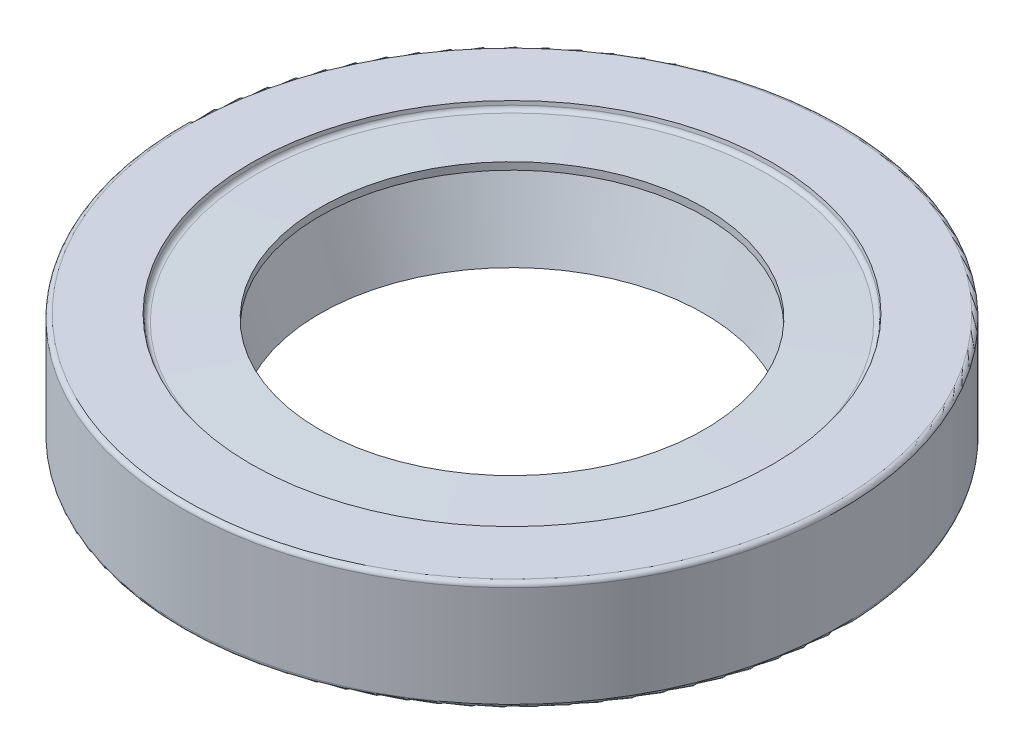
ISO-10303-21;
HEADER;
FILE_DESCRIPTION(('STEP AP214'),'2;1');
FILE_NAME('part.step','',(''),(''),'','','');
FILE_SCHEMA(('AUTOMOTIVE_DESIGN { 1 0 10303 214 1 1 1 1 }'));
ENDSEC;
DATA;
#1=APPLICATION_CONTEXT('core data for automotive mechanical design processes');
#2=APPLICATION_PROTOCOL_DEFINITION('international standard','automotive_design',2000,#1);
#3=PRODUCT_CONTEXT('',#1,'mechanical');
#4=PRODUCT('Part','Part','',(#3));
#5=PRODUCT_RELATED_PRODUCT_CATEGORY('part','',(#4));
#6=PRODUCT_DEFINITION_FORMATION('','',#4);
#7=PRODUCT_DEFINITION_CONTEXT('part definition',#1,'design');
#8=PRODUCT_DEFINITION('design','',#6,#7);
#9=PRODUCT_DEFINITION_SHAPE('','',#8);
#10=(LENGTH_UNIT() NAMED_UNIT(*) SI_UNIT(.MILLI.,.METRE.));
#11=(NAMED_UNIT(*) PLANE_ANGLE_UNIT() SI_UNIT($,.RADIAN.));
#12=(NAMED_UNIT(*) SI_UNIT($,.STERADIAN.) SOLID_ANGLE_UNIT());
#13=UNCERTAINTY_MEASURE_WITH_UNIT(LENGTH_MEASURE(1.E-05),#10,'distance_accuracy_value','');
#14=(GEOMETRIC_REPRESENTATION_CONTEXT(3) GLOBAL_UNCERTAINTY_ASSIGNED_CONTEXT((#13)) GLOBAL_UNIT_ASSIGNED_CONTEXT((#10,
#11,#12)) REPRESENTATION_CONTEXT('',''));
#15=CARTESIAN_POINT('',(0.,0.,0.));
#16=DIRECTION('',(0.,0.,1.));
#17=DIRECTION('',(1.,0.,0.));
#18=AXIS2_PLACEMENT_3D('',#15,#16,#17);
#19=CARTESIAN_POINT('',(0.,2.76666666666667,0.));
#20=DIRECTION('',(0.,-1.,0.));
#21=DIRECTION('',(0.,0.,-1.));
#22=AXIS2_PLACEMENT_3D('',#19,#20,#21);
#23=TOROIDAL_SURFACE('',#22,26.4545454545455,0.6);
#24=CARTESIAN_POINT('',(0.,2.76666666666667,-27.0545454545455));
#25=VERTEX_POINT('',#24);
#26=VERTEX_LOOP('',#25);
#27=FACE_BOUND('',#26,.T.);
#28=ADVANCED_FACE('F31',(#27),#23,.T.);
#29=CLOSED_SHELL('',(#28));
#30=CARTESIAN_POINT('',(0.,2.76666666666667,0.));
#31=DIRECTION('',(0.,-1.,0.));
#32=DIRECTION('',(0.,0.,-1.));
#33=AXIS2_PLACEMENT_3D('',#30,#31,#32);
#34=TOROIDAL_SURFACE('',#33,26.4545454545455,0.59);
#35=CARTESIAN_POINT('',(0.,2.76666666666667,-27.0445454545455));
#36=VERTEX_POINT('',#35);
#37=VERTEX_LOOP('',#36);
#38=FACE_BOUND('',#37,.T.);
#39=ADVANCED_FACE('F44',(#38),#34,.F.);
#40=CLOSED_SHELL('',(#39));
#41=ORIENTED_CLOSED_SHELL('',*,#40,.T.);
#42=BREP_WITH_VOIDS('B2',#29,(#41));
#43=CARTESIAN_POINT('',(0.,2.76666666666667,0.));
#44=DIRECTION('',(0.,1.,0.));
#45=DIRECTION('',(0.,0.,1.));
#46=AXIS2_PLACEMENT_3D('',#43,#44,#45);
#47=TOROIDAL_SURFACE('',#46,26.4545454545455,0.6);
#48=CARTESIAN_POINT('',(0.,2.16666666666667,0.));
#49=DIRECTION('',(0.,1.,0.));
#50=DIRECTION('',(0.,0.,1.));
#51=AXIS2_PLACEMENT_3D('',#48,#49,#50);
#52=CIRCLE('',#51,26.4545454545455);
#53=CARTESIAN_POINT('',(0.,2.16666666666667,26.4545454545455));
#54=VERTEX_POINT('',#53);
#55=EDGE_CURVE('E114',#54,#54,#52,.T.);
#56=ORIENTED_EDGE('',*,*,#55,.T.);
#57=EDGE_LOOP('',(#56));
#58=FACE_BOUND('',#57,.T.);
#59=CARTESIAN_POINT('',(0.,3.36666666666667,0.));
#60=DIRECTION('',(0.,1.,0.));
#61=DIRECTION('',(0.,0.,1.));
#62=AXIS2_PLACEMENT_3D('',#59,#60,#61);
#63=CIRCLE('',#62,26.4545454545455);
#64=CARTESIAN_POINT('',(0.,3.36666666666667,26.4545454545455));
#65=VERTEX_POINT('',#64);
#66=EDGE_CURVE('E87',#65,#65,#63,.T.);
#67=ORIENTED_EDGE('',*,*,#66,.F.);
#68=EDGE_LOOP('',(#67));
#69=FACE_BOUND('',#68,.T.);
#70=ADVANCED_FACE('F50',(#58,#69),#47,.F.);
#71=CARTESIAN_POINT('',(0.,20.4321766561514,0.));
#72=DIRECTION('',(0.,1.,0.));
#73=DIRECTION('',(0.,0.,1.));
#74=AXIS2_PLACEMENT_3D('',#71,#72,#73);
#75=CYLINDRICAL_SURFACE('',#74,26.4545454545455);
#76=CARTESIAN_POINT('',(0.,3.76666666666667,0.));
#77=DIRECTION('',(0.,1.,0.));
#78=DIRECTION('',(0.,0.,1.));
#79=AXIS2_PLACEMENT_3D('',#76,#77,#78);
#80=CIRCLE('',#79,26.4545454545455);
#81=CARTESIAN_POINT('',(0.,3.76666666666667,26.4545454545455));
#82=VERTEX_POINT('',#81);
#83=EDGE_CURVE('E90',#82,#82,#80,.T.);
#84=ORIENTED_EDGE('',*,*,#83,.F.);
#85=EDGE_LOOP('',(#84));
#86=FACE_BOUND('',#85,.T.);
#87=ORIENTED_EDGE('',*,*,#66,.T.);
#88=EDGE_LOOP('',(#87));
#89=FACE_BOUND('',#88,.T.);
#90=ADVANCED_FACE('F137',(#86,#89),#75,.T.);
#91=CARTESIAN_POINT('',(0.,3.76666666666667,0.));
#92=DIRECTION('',(0.,1.,0.));
#93=DIRECTION('',(0.,0.,1.));
#94=AXIS2_PLACEMENT_3D('',#91,#92,#93);
#95=CONICAL_SURFACE('',#94,26.4545454545455,0.563813690908647);
#96=CARTESIAN_POINT('',(0.,8.56666666666667,0.));
#97=DIRECTION('',(0.,1.,0.));
#98=DIRECTION('',(0.,0.,1.));
#99=AXIS2_PLACEMENT_3D('',#96,#97,#98);
#100=CIRCLE('',#99,29.4894655319308);
#101=CARTESIAN_POINT('',(0.,8.56666666666667,29.4894655319308));
#102=VERTEX_POINT('',#101);
#103=EDGE_CURVE('E93',#102,#102,#100,.T.);
#104=ORIENTED_EDGE('',*,*,#103,.F.);
#105=EDGE_LOOP('',(#104));
#106=FACE_BOUND('',#105,.T.);
#107=ORIENTED_EDGE('',*,*,#83,.T.);
#108=EDGE_LOOP('',(#107));
#109=FACE_BOUND('',#108,.T.);
#110=ADVANCED_FACE('F141',(#106,#109),#95,.T.);
#111=CARTESIAN_POINT('',(29.4894655319308,8.56666666666667,0.));
#112=DIRECTION('',(0.,1.,0.));
#113=DIRECTION('',(0.,0.,1.));
#114=AXIS2_PLACEMENT_3D('',#111,#112,#113);
#115=PLANE('',#114);
#116=CARTESIAN_POINT('',(0.,8.56666666666667,0.));
#117=DIRECTION('',(0.,1.,0.));
#118=DIRECTION('',(0.,0.,1.));
#119=AXIS2_PLACEMENT_3D('',#116,#117,#118);
#120=CIRCLE('',#119,31.4894655319308);
#121=CARTESIAN_POINT('',(0.,8.56666666666667,31.4894655319308));
#122=VERTEX_POINT('',#121);
#123=EDGE_CURVE('E96',#122,#122,#120,.T.);
#124=ORIENTED_EDGE('',*,*,#123,.F.);
#125=EDGE_LOOP('',(#124));
#126=FACE_BOUND('',#125,.T.);
#127=ORIENTED_EDGE('',*,*,#103,.T.);
#128=EDGE_LOOP('',(#127));
#129=FACE_BOUND('',#128,.T.);
#130=ADVANCED_FACE('F146',(#126,#129),#115,.F.);
#131=CARTESIAN_POINT('',(0.,8.56666666666667,0.));
#132=DIRECTION('',(0.,-1.,0.));
#133=DIRECTION('',(0.,0.,-1.));
#134=AXIS2_PLACEMENT_3D('',#131,#132,#133);
#135=CONICAL_SURFACE('',#134,31.4894655319308,0.17453292519943);
#136=CARTESIAN_POINT('',(0.,0.,0.));
#137=DIRECTION('',(0.,1.,0.));
#138=DIRECTION('',(0.,0.,1.));
#139=AXIS2_PLACEMENT_3D('',#136,#137,#138);
#140=CIRCLE('',#139,33.);
#141=CARTESIAN_POINT('',(0.,0.,33.));
#142=VERTEX_POINT('',#141);
#143=EDGE_CURVE('E99',#142,#142,#140,.T.);
#144=ORIENTED_EDGE('',*,*,#143,.F.);
#145=EDGE_LOOP('',(#144));
#146=FACE_BOUND('',#145,.T.);
#147=ORIENTED_EDGE('',*,*,#123,.T.);
#148=EDGE_LOOP('',(#147));
#149=FACE_BOUND('',#148,.T.);
#150=ADVANCED_FACE('F154',(#146,#149),#135,.F.);
#151=CARTESIAN_POINT('',(33.,0.,0.));
#152=DIRECTION('',(0.,1.,0.));
#153=DIRECTION('',(0.,0.,1.));
#154=AXIS2_PLACEMENT_3D('',#151,#152,#153);
#155=PLANE('',#154);
#156=CARTESIAN_POINT('',(0.,0.,0.));
#157=DIRECTION('',(0.,1.,0.));
#158=DIRECTION('',(0.,0.,1.));
#159=AXIS2_PLACEMENT_3D('',#156,#157,#158);
#160=CIRCLE('',#159,35.52);
#161=CARTESIAN_POINT('',(0.,0.,35.52));
#162=VERTEX_POINT('',#161);
#163=EDGE_CURVE('E75',#162,#162,#160,.F.);
#164=ORIENTED_EDGE('',*,*,#163,.T.);
#165=EDGE_LOOP('',(#164));
#166=FACE_BOUND('',#165,.T.);
#167=ORIENTED_EDGE('',*,*,#143,.T.);
#168=EDGE_LOOP('',(#167));
#169=FACE_BOUND('',#168,.T.);
#170=ADVANCED_FACE('F158',(#166,#169),#155,.F.);
#171=CARTESIAN_POINT('',(0.,20.4321766561514,0.));
#172=DIRECTION('',(0.,1.,0.));
#173=DIRECTION('',(0.,0.,1.));
#174=AXIS2_PLACEMENT_3D('',#171,#172,#173);
#175=CYLINDRICAL_SURFACE('',#174,36.);
#176=CARTESIAN_POINT('',(0.,11.52,0.));
#177=DIRECTION('',(0.,-1.,0.));
#178=DIRECTION('',(0.,0.,-1.));
#179=AXIS2_PLACEMENT_3D('',#176,#177,#178);
#180=CIRCLE('',#179,36.);
#181=CARTESIAN_POINT('',(0.,11.52,-36.));
#182=VERTEX_POINT('',#181);
#183=EDGE_CURVE('E78',#182,#182,#180,.T.);
#184=ORIENTED_EDGE('',*,*,#183,.T.);
#185=EDGE_LOOP('',(#184));
#186=FACE_BOUND('',#185,.T.);
#187=CARTESIAN_POINT('',(0.,0.480000000000001,0.));
#188=DIRECTION('',(0.,1.,0.));
#189=DIRECTION('',(0.,0.,1.));
#190=AXIS2_PLACEMENT_3D('',#187,#188,#189);
#191=CIRCLE('',#190,36.);
#192=CARTESIAN_POINT('',(0.,0.480000000000001,36.));
#193=VERTEX_POINT('',#192);
#194=EDGE_CURVE('E81',#193,#193,#191,.T.);
#195=ORIENTED_EDGE('',*,*,#194,.T.);
#196=EDGE_LOOP('',(#195));
#197=FACE_BOUND('',#196,.T.);
#198=ADVANCED_FACE('F162',(#186,#197),#175,.T.);
#199=CARTESIAN_POINT('',(36.,12.,0.));
#200=DIRECTION('',(0.,-1.,0.));
#201=DIRECTION('',(0.,0.,-1.));
#202=AXIS2_PLACEMENT_3D('',#199,#200,#201);
#203=PLANE('',#202);
#204=CARTESIAN_POINT('',(0.,12.,0.));
#205=DIRECTION('',(0.,-1.,0.));
#206=DIRECTION('',(0.,0.,-1.));
#207=AXIS2_PLACEMENT_3D('',#204,#205,#206);
#208=CIRCLE('',#207,35.52);
#209=CARTESIAN_POINT('',(0.,12.,-35.52));
#210=VERTEX_POINT('',#209);
#211=EDGE_CURVE('E84',#210,#210,#208,.F.);
#212=ORIENTED_EDGE('',*,*,#211,.T.);
#213=EDGE_LOOP('',(#212));
#214=FACE_BOUND('',#213,.T.);
#215=CARTESIAN_POINT('',(0.,12.,0.));
#216=DIRECTION('',(0.,1.,0.));
#217=DIRECTION('',(0.,0.,1.));
#218=AXIS2_PLACEMENT_3D('',#215,#216,#217);
#219=CIRCLE('',#218,28.5);
#220=CARTESIAN_POINT('',(0.,12.,28.5));
#221=VERTEX_POINT('',#220);
#222=EDGE_CURVE('E102',#221,#221,#219,.T.);
#223=ORIENTED_EDGE('',*,*,#222,.F.);
#224=EDGE_LOOP('',(#223));
#225=FACE_BOUND('',#224,.T.);
#226=ADVANCED_FACE('F166',(#214,#225),#203,.F.);
#227=CARTESIAN_POINT('',(0.,12.,0.));
#228=DIRECTION('',(0.,1.,0.));
#229=DIRECTION('',(0.,0.,1.));
#230=AXIS2_PLACEMENT_3D('',#227,#228,#229);
#231=CONICAL_SURFACE('',#230,28.5,0.174532925199428);
#232=CARTESIAN_POINT('',(0.,11.6144799286238,0.));
#233=DIRECTION('',(0.,1.,0.));
#234=DIRECTION('',(0.,0.,1.));
#235=AXIS2_PLACEMENT_3D('',#232,#233,#234);
#236=CIRCLE('',#235,28.4320224098117);
#237=CARTESIAN_POINT('',(0.,11.6144799286238,28.4320224098117));
#238=VERTEX_POINT('',#237);
#239=EDGE_CURVE('E60',#238,#238,#236,.F.);
#240=ORIENTED_EDGE('',*,*,#239,.T.);
#241=EDGE_LOOP('',(#240));
#242=FACE_BOUND('',#241,.T.);
#243=ORIENTED_EDGE('',*,*,#222,.T.);
#244=EDGE_LOOP('',(#243));
#245=FACE_BOUND('',#244,.T.);
#246=ADVANCED_FACE('F170',(#242,#245),#231,.F.);
#247=CARTESIAN_POINT('',(0.,11.2,0.));
#248=DIRECTION('',(0.,-1.,0.));
#249=DIRECTION('',(0.,0.,-1.));
#250=AXIS2_PLACEMENT_3D('',#247,#248,#249);
#251=CONICAL_SURFACE('',#250,28.3589384154332,1.52733917115915);
#252=CARTESIAN_POINT('',(0.,11.2182842284282,0.));
#253=DIRECTION('',(0.,-1.,0.));
#254=DIRECTION('',(0.,0.,-1.));
#255=AXIS2_PLACEMENT_3D('',#252,#253,#254);
#256=CIRCLE('',#255,27.9384618186326);
#257=CARTESIAN_POINT('',(0.,11.2182842284282,-27.9384618186326));
#258=VERTEX_POINT('',#257);
#259=EDGE_CURVE('E64',#258,#258,#256,.F.);
#260=ORIENTED_EDGE('',*,*,#259,.T.);
#261=EDGE_LOOP('',(#260));
#262=FACE_BOUND('',#261,.T.);
#263=CARTESIAN_POINT('',(0.,11.52,0.));
#264=DIRECTION('',(0.,1.,0.));
#265=DIRECTION('',(0.,0.,1.));
#266=AXIS2_PLACEMENT_3D('',#263,#264,#265);
#267=CIRCLE('',#266,21.);
#268=CARTESIAN_POINT('',(0.,11.52,21.));
#269=VERTEX_POINT('',#268);
#270=EDGE_CURVE('E105',#269,#269,#267,.T.);
#271=ORIENTED_EDGE('',*,*,#270,.F.);
#272=EDGE_LOOP('',(#271));
#273=FACE_BOUND('',#272,.T.);
#274=ADVANCED_FACE('F174',(#262,#273),#251,.T.);
#275=CARTESIAN_POINT('',(0.,20.4321766561514,0.));
#276=DIRECTION('',(0.,1.,0.));
#277=DIRECTION('',(0.,0.,1.));
#278=AXIS2_PLACEMENT_3D('',#275,#276,#277);
#279=CYLINDRICAL_SURFACE('',#278,21.);
#280=CARTESIAN_POINT('',(0.,10.72,0.));
#281=DIRECTION('',(0.,1.,0.));
#282=DIRECTION('',(0.,0.,1.));
#283=AXIS2_PLACEMENT_3D('',#280,#281,#282);
#284=CIRCLE('',#283,21.);
#285=CARTESIAN_POINT('',(0.,10.72,21.));
#286=VERTEX_POINT('',#285);
#287=EDGE_CURVE('E108',#286,#286,#284,.T.);
#288=ORIENTED_EDGE('',*,*,#287,.F.);
#289=EDGE_LOOP('',(#288));
#290=FACE_BOUND('',#289,.T.);
#291=ORIENTED_EDGE('',*,*,#270,.T.);
#292=EDGE_LOOP('',(#291));
#293=FACE_BOUND('',#292,.T.);
#294=ADVANCED_FACE('F178',(#290,#293),#279,.F.);
#295=CARTESIAN_POINT('',(21.,10.72,0.));
#296=DIRECTION('',(0.,1.,0.));
#297=DIRECTION('',(0.,0.,1.));
#298=AXIS2_PLACEMENT_3D('',#295,#296,#297);
#299=PLANE('',#298);
#300=CARTESIAN_POINT('',(0.,10.72,0.));
#301=DIRECTION('',(0.,1.,0.));
#302=DIRECTION('',(0.,0.,1.));
#303=AXIS2_PLACEMENT_3D('',#300,#301,#302);
#304=CIRCLE('',#303,23.2132871545407);
#305=CARTESIAN_POINT('',(0.,10.72,23.2132871545407));
#306=VERTEX_POINT('',#305);
#307=EDGE_CURVE('E29',#306,#306,#304,.F.);
#308=ORIENTED_EDGE('',*,*,#307,.T.);
#309=EDGE_LOOP('',(#308));
#310=FACE_BOUND('',#309,.T.);
#311=ORIENTED_EDGE('',*,*,#287,.T.);
#312=EDGE_LOOP('',(#311));
#313=FACE_BOUND('',#312,.T.);
#314=ADVANCED_FACE('F182',(#310,#313),#299,.F.);
#315=CARTESIAN_POINT('',(0.,10.72,0.));
#316=DIRECTION('',(0.,1.,0.));
#317=DIRECTION('',(0.,0.,1.));
#318=AXIS2_PLACEMENT_3D('',#315,#316,#317);
#319=CONICAL_SURFACE('',#318,24.3558055599344,0.349065850398871);
#320=CARTESIAN_POINT('',(0.,9.64638388533946,0.));
#321=DIRECTION('',(0.,1.,0.));
#322=DIRECTION('',(0.,0.,1.));
#323=AXIS2_PLACEMENT_3D('',#320,#321,#322);
#324=CIRCLE('',#323,23.9650412511695);
#325=CARTESIAN_POINT('',(0.,9.64638388533946,23.9650412511695));
#326=VERTEX_POINT('',#325);
#327=EDGE_CURVE('E56',#326,#326,#324,.T.);
#328=ORIENTED_EDGE('',*,*,#327,.T.);
#329=EDGE_LOOP('',(#328));
#330=FACE_BOUND('',#329,.T.);
#331=CARTESIAN_POINT('',(0.,1.5,0.));
#332=DIRECTION('',(0.,1.,0.));
#333=DIRECTION('',(0.,0.,1.));
#334=AXIS2_PLACEMENT_3D('',#331,#332,#333);
#335=CIRCLE('',#334,21.);
#336=CARTESIAN_POINT('',(0.,1.5,21.));
#337=VERTEX_POINT('',#336);
#338=EDGE_CURVE('E111',#337,#337,#335,.T.);
#339=ORIENTED_EDGE('',*,*,#338,.F.);
#340=EDGE_LOOP('',(#339));
#341=FACE_BOUND('',#340,.T.);
#342=ADVANCED_FACE('F133',(#330,#341),#319,.F.);
#343=CARTESIAN_POINT('',(21.,1.5,0.));
#344=DIRECTION('',(0.,1.,0.));
#345=DIRECTION('',(0.,0.,1.));
#346=AXIS2_PLACEMENT_3D('',#343,#344,#345);
#347=PLANE('',#346);
#348=CARTESIAN_POINT('',(0.,1.5,0.));
#349=DIRECTION('',(0.,1.,0.));
#350=DIRECTION('',(0.,0.,1.));
#351=AXIS2_PLACEMENT_3D('',#348,#349,#350);
#352=CIRCLE('',#351,25.9745454545455);
#353=CARTESIAN_POINT('',(0.,1.5,25.9745454545455));
#354=VERTEX_POINT('',#353);
#355=EDGE_CURVE('E69',#354,#354,#352,.F.);
#356=ORIENTED_EDGE('',*,*,#355,.T.);
#357=EDGE_LOOP('',(#356));
#358=FACE_BOUND('',#357,.T.);
#359=ORIENTED_EDGE('',*,*,#338,.T.);
#360=EDGE_LOOP('',(#359));
#361=FACE_BOUND('',#360,.T.);
#362=ADVANCED_FACE('F123',(#358,#361),#347,.F.);
#363=CARTESIAN_POINT('',(0.,20.4321766561514,0.));
#364=DIRECTION('',(0.,1.,0.));
#365=DIRECTION('',(0.,0.,1.));
#366=AXIS2_PLACEMENT_3D('',#363,#364,#365);
#367=CYLINDRICAL_SURFACE('',#366,26.4545454545455);
#368=CARTESIAN_POINT('',(0.,1.98,0.));
#369=DIRECTION('',(0.,1.,0.));
#370=DIRECTION('',(0.,0.,1.));
#371=AXIS2_PLACEMENT_3D('',#368,#369,#370);
#372=CIRCLE('',#371,26.4545454545455);
#373=CARTESIAN_POINT('',(0.,1.98,26.4545454545455));
#374=VERTEX_POINT('',#373);
#375=EDGE_CURVE('E72',#374,#374,#372,.T.);
#376=ORIENTED_EDGE('',*,*,#375,.T.);
#377=EDGE_LOOP('',(#376));
#378=FACE_BOUND('',#377,.T.);
#379=ORIENTED_EDGE('',*,*,#55,.F.);
#380=EDGE_LOOP('',(#379));
#381=FACE_BOUND('',#380,.T.);
#382=ADVANCED_FACE('F120',(#378,#381),#367,.T.);
#383=CARTESIAN_POINT('',(0.,11.52,0.));
#384=DIRECTION('',(0.,-1.,0.));
#385=DIRECTION('',(0.,0.,-1.));
#386=AXIS2_PLACEMENT_3D('',#383,#384,#385);
#387=TOROIDAL_SURFACE('',#386,35.52,0.48);
#388=ORIENTED_EDGE('',*,*,#183,.F.);
#389=EDGE_LOOP('',(#388));
#390=FACE_BOUND('',#389,.T.);
#391=ORIENTED_EDGE('',*,*,#211,.F.);
#392=EDGE_LOOP('',(#391));
#393=FACE_BOUND('',#392,.T.);
#394=ADVANCED_FACE('F122',(#390,#393),#387,.T.);
#395=CARTESIAN_POINT('',(0.,0.480000000000001,0.));
#396=DIRECTION('',(0.,1.,0.));
#397=DIRECTION('',(0.,0.,1.));
#398=AXIS2_PLACEMENT_3D('',#395,#396,#397);
#399=TOROIDAL_SURFACE('',#398,35.52,0.48);
#400=ORIENTED_EDGE('',*,*,#163,.F.);
#401=EDGE_LOOP('',(#400));
#402=FACE_BOUND('',#401,.T.);
#403=ORIENTED_EDGE('',*,*,#194,.F.);
#404=EDGE_LOOP('',(#403));
#405=FACE_BOUND('',#404,.T.);
#406=ADVANCED_FACE('F130',(#402,#405),#399,.T.);
#407=CARTESIAN_POINT('',(0.,1.98,0.));
#408=DIRECTION('',(0.,1.,0.));
#409=DIRECTION('',(0.,0.,1.));
#410=AXIS2_PLACEMENT_3D('',#407,#408,#409);
#411=TOROIDAL_SURFACE('',#410,25.9745454545455,0.48);
#412=ORIENTED_EDGE('',*,*,#355,.F.);
#413=EDGE_LOOP('',(#412));
#414=FACE_BOUND('',#413,.T.);
#415=ORIENTED_EDGE('',*,*,#375,.F.);
#416=EDGE_LOOP('',(#415));
#417=FACE_BOUND('',#416,.T.);
#418=ADVANCED_FACE('F211',(#414,#417),#411,.T.);
#419=CARTESIAN_POINT('',(0.,11.6978310539039,0.));
#420=DIRECTION('',(0.,1.,0.));
#421=DIRECTION('',(0.,0.,1.));
#422=AXIS2_PLACEMENT_3D('',#419,#420,#421);
#423=TOROIDAL_SURFACE('',#422,27.9593146883659,0.48);
#424=ORIENTED_EDGE('',*,*,#239,.F.);
#425=EDGE_LOOP('',(#424));
#426=FACE_BOUND('',#425,.T.);
#427=ORIENTED_EDGE('',*,*,#259,.F.);
#428=EDGE_LOOP('',(#427));
#429=FACE_BOUND('',#428,.T.);
#430=ADVANCED_FACE('F202',(#426,#429),#423,.F.);
#431=CARTESIAN_POINT('',(0.,9.92,0.));
#432=DIRECTION('',(0.,1.,0.));
#433=DIRECTION('',(0.,0.,1.));
#434=AXIS2_PLACEMENT_3D('',#431,#432,#433);
#435=TOROIDAL_SURFACE('',#434,23.2132871545407,0.8);
#436=ORIENTED_EDGE('',*,*,#307,.F.);
#437=EDGE_LOOP('',(#436));
#438=FACE_BOUND('',#437,.T.);
#439=ORIENTED_EDGE('',*,*,#327,.F.);
#440=EDGE_LOOP('',(#439));
#441=FACE_BOUND('',#440,.T.);
#442=ADVANCED_FACE('F199',(#438,#441),#435,.F.);
#443=CLOSED_SHELL('',(#70,#90,#110,#130,#150,#170,#198,#226,#246,#274,#294,#314,#342,#362,#382,
#394,#406,#418,#430,#442));
#444=MANIFOLD_SOLID_BREP('B6',#443);
#445=ADVANCED_BREP_SHAPE_REPRESENTATION('',(#18,#42,#444),#14);
#446=SHAPE_DEFINITION_REPRESENTATION(#9,#445);
ENDSEC;
END-ISO-10303-21;
